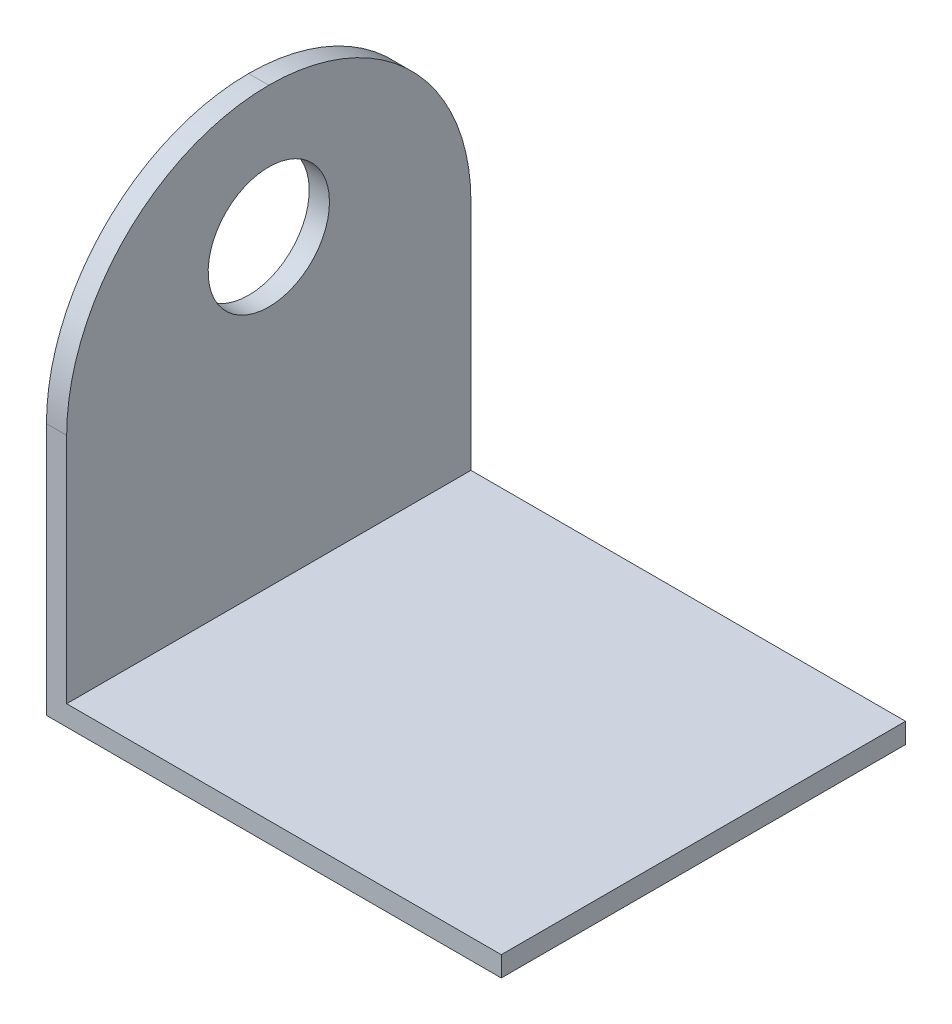
ISO-10303-21;
HEADER;
FILE_DESCRIPTION(('STEP AP214'),'2;1');
FILE_NAME('part.step','',(''),(''),'','','');
FILE_SCHEMA(('AUTOMOTIVE_DESIGN { 1 0 10303 214 1 1 1 1 }'));
ENDSEC;
DATA;
#1=APPLICATION_CONTEXT('core data for automotive mechanical design processes');
#2=APPLICATION_PROTOCOL_DEFINITION('international standard','automotive_design',2000,#1);
#3=PRODUCT_CONTEXT('',#1,'mechanical');
#4=PRODUCT('Part','Part','',(#3));
#5=PRODUCT_RELATED_PRODUCT_CATEGORY('part','',(#4));
#6=PRODUCT_DEFINITION_FORMATION('','',#4);
#7=PRODUCT_DEFINITION_CONTEXT('part definition',#1,'design');
#8=PRODUCT_DEFINITION('design','',#6,#7);
#9=PRODUCT_DEFINITION_SHAPE('','',#8);
#10=(LENGTH_UNIT() NAMED_UNIT(*) SI_UNIT(.MILLI.,.METRE.));
#11=(NAMED_UNIT(*) PLANE_ANGLE_UNIT() SI_UNIT($,.RADIAN.));
#12=(NAMED_UNIT(*) SI_UNIT($,.STERADIAN.) SOLID_ANGLE_UNIT());
#13=UNCERTAINTY_MEASURE_WITH_UNIT(LENGTH_MEASURE(1.E-05),#10,'distance_accuracy_value','');
#14=(GEOMETRIC_REPRESENTATION_CONTEXT(3) GLOBAL_UNCERTAINTY_ASSIGNED_CONTEXT((#13)) GLOBAL_UNIT_ASSIGNED_CONTEXT((#10,
#11,#12)) REPRESENTATION_CONTEXT('',''));
#15=CARTESIAN_POINT('',(0.,0.,0.));
#16=DIRECTION('',(0.,0.,1.));
#17=DIRECTION('',(1.,0.,0.));
#18=AXIS2_PLACEMENT_3D('',#15,#16,#17);
#19=CARTESIAN_POINT('',(2.,0.,-40.));
#20=DIRECTION('',(1.,0.,0.));
#21=DIRECTION('',(0.,0.,-1.));
#22=AXIS2_PLACEMENT_3D('',#19,#20,#21);
#23=PLANE('',#22);
#24=CARTESIAN_POINT('',(2.,-13.0021745138552,-20.));
#25=DIRECTION('',(1.,0.,0.));
#26=DIRECTION('',(0.,0.,-1.));
#27=AXIS2_PLACEMENT_3D('',#24,#25,#26);
#28=CIRCLE('',#27,6.00000000000004);
#29=CARTESIAN_POINT('',(2.,-13.0021745138552,-26.));
#30=VERTEX_POINT('',#29);
#31=EDGE_CURVE('E135',#30,#30,#28,.T.);
#32=ORIENTED_EDGE('',*,*,#31,.F.);
#33=EDGE_LOOP('',(#32));
#34=FACE_BOUND('',#33,.T.);
#35=CARTESIAN_POINT('',(2.,-20.,-20.));
#36=DIRECTION('',(1.,0.,0.));
#37=DIRECTION('',(0.,0.,-1.));
#38=AXIS2_PLACEMENT_3D('',#35,#36,#37);
#39=CIRCLE('',#38,20.);
#40=CARTESIAN_POINT('',(2.,-20.,-40.));
#41=VERTEX_POINT('',#40);
#42=CARTESIAN_POINT('',(2.,0.,-20.));
#43=VERTEX_POINT('',#42);
#44=EDGE_CURVE('E154',#41,#43,#39,.T.);
#45=ORIENTED_EDGE('',*,*,#44,.T.);
#46=CARTESIAN_POINT('',(2.,-20.,-20.));
#47=DIRECTION('',(1.,0.,0.));
#48=DIRECTION('',(0.,0.,-1.));
#49=AXIS2_PLACEMENT_3D('',#46,#47,#48);
#50=CIRCLE('',#49,20.);
#51=CARTESIAN_POINT('',(2.,-20.,0.));
#52=VERTEX_POINT('',#51);
#53=EDGE_CURVE('E11',#43,#52,#50,.T.);
#54=ORIENTED_EDGE('',*,*,#53,.T.);
#55=DIRECTION('',(0.,1.,0.));
#56=VECTOR('',#55,1.);
#57=CARTESIAN_POINT('',(2.,0.,0.));
#58=LINE('',#57,#56);
#59=CARTESIAN_POINT('',(2.,-43.,0.));
#60=VERTEX_POINT('',#59);
#61=EDGE_CURVE('E109',#60,#52,#58,.T.);
#62=ORIENTED_EDGE('',*,*,#61,.F.);
#63=DIRECTION('',(0.,0.,1.));
#64=VECTOR('',#63,1.);
#65=CARTESIAN_POINT('',(2.,-43.,-40.));
#66=LINE('',#65,#64);
#67=CARTESIAN_POINT('',(2.,-43.,-40.));
#68=VERTEX_POINT('',#67);
#69=EDGE_CURVE('E144',#68,#60,#66,.T.);
#70=ORIENTED_EDGE('',*,*,#69,.F.);
#71=DIRECTION('',(0.,1.,0.));
#72=VECTOR('',#71,1.);
#73=CARTESIAN_POINT('',(2.,0.,-40.));
#74=LINE('',#73,#72);
#75=EDGE_CURVE('E117',#68,#41,#74,.T.);
#76=ORIENTED_EDGE('',*,*,#75,.T.);
#77=EDGE_LOOP('',(#45,#54,#62,#70,#76));
#78=FACE_BOUND('',#77,.T.);
#79=ADVANCED_FACE('F39',(#34,#78),#23,.T.);
#80=CARTESIAN_POINT('',(2.,-43.,-40.));
#81=DIRECTION('',(0.,1.,0.));
#82=DIRECTION('',(0.,0.,1.));
#83=AXIS2_PLACEMENT_3D('',#80,#81,#82);
#84=PLANE('',#83);
#85=DIRECTION('',(-1.,0.,0.));
#86=VECTOR('',#85,1.);
#87=CARTESIAN_POINT('',(2.,-43.,0.));
#88=LINE('',#87,#86);
#89=CARTESIAN_POINT('',(45.,-43.,0.));
#90=VERTEX_POINT('',#89);
#91=EDGE_CURVE('E140',#90,#60,#88,.T.);
#92=ORIENTED_EDGE('',*,*,#91,.F.);
#93=DIRECTION('',(0.,0.,1.));
#94=VECTOR('',#93,1.);
#95=CARTESIAN_POINT('',(45.,-43.,-40.));
#96=LINE('',#95,#94);
#97=CARTESIAN_POINT('',(45.,-43.,-40.));
#98=VERTEX_POINT('',#97);
#99=EDGE_CURVE('E147',#98,#90,#96,.T.);
#100=ORIENTED_EDGE('',*,*,#99,.F.);
#101=DIRECTION('',(-1.,0.,0.));
#102=VECTOR('',#101,1.);
#103=CARTESIAN_POINT('',(2.,-43.,-40.));
#104=LINE('',#103,#102);
#105=EDGE_CURVE('E125',#98,#68,#104,.T.);
#106=ORIENTED_EDGE('',*,*,#105,.T.);
#107=ORIENTED_EDGE('',*,*,#69,.T.);
#108=EDGE_LOOP('',(#92,#100,#106,#107));
#109=FACE_BOUND('',#108,.T.);
#110=ADVANCED_FACE('F166',(#109),#84,.T.);
#111=CARTESIAN_POINT('',(45.,-43.,-40.));
#112=DIRECTION('',(1.,0.,0.));
#113=DIRECTION('',(0.,0.,-1.));
#114=AXIS2_PLACEMENT_3D('',#111,#112,#113);
#115=PLANE('',#114);
#116=DIRECTION('',(0.,1.,0.));
#117=VECTOR('',#116,1.);
#118=CARTESIAN_POINT('',(45.,-43.,0.));
#119=LINE('',#118,#117);
#120=CARTESIAN_POINT('',(45.,-45.,0.));
#121=VERTEX_POINT('',#120);
#122=EDGE_CURVE('E137',#121,#90,#119,.T.);
#123=ORIENTED_EDGE('',*,*,#122,.F.);
#124=DIRECTION('',(0.,0.,1.));
#125=VECTOR('',#124,1.);
#126=CARTESIAN_POINT('',(45.,-45.,-40.));
#127=LINE('',#126,#125);
#128=CARTESIAN_POINT('',(45.,-45.,-40.));
#129=VERTEX_POINT('',#128);
#130=EDGE_CURVE('E116',#129,#121,#127,.T.);
#131=ORIENTED_EDGE('',*,*,#130,.F.);
#132=DIRECTION('',(0.,1.,0.));
#133=VECTOR('',#132,1.);
#134=CARTESIAN_POINT('',(45.,-43.,-40.));
#135=LINE('',#134,#133);
#136=EDGE_CURVE('E123',#129,#98,#135,.T.);
#137=ORIENTED_EDGE('',*,*,#136,.T.);
#138=ORIENTED_EDGE('',*,*,#99,.T.);
#139=EDGE_LOOP('',(#123,#131,#137,#138));
#140=FACE_BOUND('',#139,.T.);
#141=ADVANCED_FACE('F169',(#140),#115,.T.);
#142=CARTESIAN_POINT('',(0.,-45.,-40.));
#143=DIRECTION('',(0.,-1.,0.));
#144=DIRECTION('',(0.,0.,-1.));
#145=AXIS2_PLACEMENT_3D('',#142,#143,#144);
#146=PLANE('',#145);
#147=DIRECTION('',(1.,0.,0.));
#148=VECTOR('',#147,1.);
#149=CARTESIAN_POINT('',(0.,-45.,0.));
#150=LINE('',#149,#148);
#151=CARTESIAN_POINT('',(0.,-45.,0.));
#152=VERTEX_POINT('',#151);
#153=EDGE_CURVE('E115',#152,#121,#150,.T.);
#154=ORIENTED_EDGE('',*,*,#153,.F.);
#155=DIRECTION('',(0.,0.,1.));
#156=VECTOR('',#155,1.);
#157=CARTESIAN_POINT('',(0.,-45.,-40.));
#158=LINE('',#157,#156);
#159=CARTESIAN_POINT('',(0.,-45.,-40.));
#160=VERTEX_POINT('',#159);
#161=EDGE_CURVE('E101',#160,#152,#158,.T.);
#162=ORIENTED_EDGE('',*,*,#161,.F.);
#163=DIRECTION('',(1.,0.,0.));
#164=VECTOR('',#163,1.);
#165=CARTESIAN_POINT('',(0.,-45.,-40.));
#166=LINE('',#165,#164);
#167=EDGE_CURVE('E108',#160,#129,#166,.T.);
#168=ORIENTED_EDGE('',*,*,#167,.T.);
#169=ORIENTED_EDGE('',*,*,#130,.T.);
#170=EDGE_LOOP('',(#154,#162,#168,#169));
#171=FACE_BOUND('',#170,.T.);
#172=ADVANCED_FACE('F113',(#171),#146,.T.);
#173=CARTESIAN_POINT('',(0.,0.,-40.));
#174=DIRECTION('',(-1.,0.,0.));
#175=DIRECTION('',(0.,-1.,0.));
#176=AXIS2_PLACEMENT_3D('',#173,#174,#175);
#177=PLANE('',#176);
#178=CARTESIAN_POINT('',(0.,-13.0021745138552,-20.));
#179=DIRECTION('',(-1.,0.,0.));
#180=DIRECTION('',(0.,-1.,0.));
#181=AXIS2_PLACEMENT_3D('',#178,#179,#180);
#182=CIRCLE('',#181,6.00000000000004);
#183=CARTESIAN_POINT('',(0.,-19.0021745138552,-20.));
#184=VERTEX_POINT('',#183);
#185=EDGE_CURVE('E201',#184,#184,#182,.T.);
#186=ORIENTED_EDGE('',*,*,#185,.F.);
#187=EDGE_LOOP('',(#186));
#188=FACE_BOUND('',#187,.T.);
#189=DIRECTION('',(0.,-1.,0.));
#190=VECTOR('',#189,1.);
#191=CARTESIAN_POINT('',(0.,0.,0.));
#192=LINE('',#191,#190);
#193=CARTESIAN_POINT('',(0.,-20.,0.));
#194=VERTEX_POINT('',#193);
#195=EDGE_CURVE('E133',#194,#152,#192,.T.);
#196=ORIENTED_EDGE('',*,*,#195,.F.);
#197=CARTESIAN_POINT('',(0.,-20.,-20.));
#198=DIRECTION('',(-1.,0.,0.));
#199=DIRECTION('',(0.,-1.,0.));
#200=AXIS2_PLACEMENT_3D('',#197,#198,#199);
#201=CIRCLE('',#200,20.);
#202=CARTESIAN_POINT('',(0.,0.,-20.));
#203=VERTEX_POINT('',#202);
#204=EDGE_CURVE('E47',#194,#203,#201,.T.);
#205=ORIENTED_EDGE('',*,*,#204,.T.);
#206=CARTESIAN_POINT('',(0.,-20.,-20.));
#207=DIRECTION('',(-1.,0.,0.));
#208=DIRECTION('',(0.,-1.,0.));
#209=AXIS2_PLACEMENT_3D('',#206,#207,#208);
#210=CIRCLE('',#209,20.);
#211=CARTESIAN_POINT('',(0.,-20.,-40.));
#212=VERTEX_POINT('',#211);
#213=EDGE_CURVE('E104',#203,#212,#210,.T.);
#214=ORIENTED_EDGE('',*,*,#213,.T.);
#215=DIRECTION('',(0.,-1.,0.));
#216=VECTOR('',#215,1.);
#217=CARTESIAN_POINT('',(0.,0.,-40.));
#218=LINE('',#217,#216);
#219=EDGE_CURVE('E97',#212,#160,#218,.T.);
#220=ORIENTED_EDGE('',*,*,#219,.T.);
#221=ORIENTED_EDGE('',*,*,#161,.T.);
#222=EDGE_LOOP('',(#196,#205,#214,#220,#221));
#223=FACE_BOUND('',#222,.T.);
#224=ADVANCED_FACE('F100',(#188,#223),#177,.T.);
#225=CARTESIAN_POINT('',(0.,0.,-40.));
#226=DIRECTION('',(0.,0.,-1.));
#227=DIRECTION('',(-1.,0.,0.));
#228=AXIS2_PLACEMENT_3D('',#225,#226,#227);
#229=PLANE('',#228);
#230=ORIENTED_EDGE('',*,*,#219,.F.);
#231=DIRECTION('',(-1.,0.,0.));
#232=VECTOR('',#231,1.);
#233=CARTESIAN_POINT('',(0.,-20.,-40.));
#234=LINE('',#233,#232);
#235=EDGE_CURVE('E152',#212,#41,#234,.F.);
#236=ORIENTED_EDGE('',*,*,#235,.T.);
#237=ORIENTED_EDGE('',*,*,#75,.F.);
#238=ORIENTED_EDGE('',*,*,#105,.F.);
#239=ORIENTED_EDGE('',*,*,#136,.F.);
#240=ORIENTED_EDGE('',*,*,#167,.F.);
#241=EDGE_LOOP('',(#230,#236,#237,#238,#239,#240));
#242=FACE_BOUND('',#241,.T.);
#243=ADVANCED_FACE('F120',(#242),#229,.T.);
#244=CARTESIAN_POINT('',(0.,0.,0.));
#245=DIRECTION('',(0.,0.,-1.));
#246=DIRECTION('',(-1.,0.,0.));
#247=AXIS2_PLACEMENT_3D('',#244,#245,#246);
#248=PLANE('',#247);
#249=ORIENTED_EDGE('',*,*,#61,.T.);
#250=DIRECTION('',(-1.,0.,0.));
#251=VECTOR('',#250,1.);
#252=CARTESIAN_POINT('',(0.,-20.,0.));
#253=LINE('',#252,#251);
#254=EDGE_CURVE('E156',#52,#194,#253,.T.);
#255=ORIENTED_EDGE('',*,*,#254,.T.);
#256=ORIENTED_EDGE('',*,*,#195,.T.);
#257=ORIENTED_EDGE('',*,*,#153,.T.);
#258=ORIENTED_EDGE('',*,*,#122,.T.);
#259=ORIENTED_EDGE('',*,*,#91,.T.);
#260=EDGE_LOOP('',(#249,#255,#256,#257,#258,#259));
#261=FACE_BOUND('',#260,.T.);
#262=ADVANCED_FACE('F162',(#261),#248,.F.);
#263=CARTESIAN_POINT('',(0.,-20.,-20.));
#264=DIRECTION('',(-1.,0.,0.));
#265=DIRECTION('',(0.,0.,1.));
#266=AXIS2_PLACEMENT_3D('',#263,#264,#265);
#267=CYLINDRICAL_SURFACE('',#266,20.);
#268=ORIENTED_EDGE('',*,*,#44,.F.);
#269=ORIENTED_EDGE('',*,*,#235,.F.);
#270=ORIENTED_EDGE('',*,*,#213,.F.);
#271=DIRECTION('',(-1.,0.,0.));
#272=VECTOR('',#271,1.);
#273=CARTESIAN_POINT('',(0.,0.,-20.));
#274=LINE('',#273,#272);
#275=EDGE_CURVE('E146',#43,#203,#274,.T.);
#276=ORIENTED_EDGE('',*,*,#275,.F.);
#277=EDGE_LOOP('',(#268,#269,#270,#276));
#278=FACE_BOUND('',#277,.T.);
#279=ADVANCED_FACE('F160',(#278),#267,.T.);
#280=CARTESIAN_POINT('',(0.,-20.,-20.));
#281=DIRECTION('',(1.,0.,0.));
#282=DIRECTION('',(0.,0.,-1.));
#283=AXIS2_PLACEMENT_3D('',#280,#281,#282);
#284=CYLINDRICAL_SURFACE('',#283,20.);
#285=ORIENTED_EDGE('',*,*,#53,.F.);
#286=ORIENTED_EDGE('',*,*,#275,.T.);
#287=ORIENTED_EDGE('',*,*,#204,.F.);
#288=ORIENTED_EDGE('',*,*,#254,.F.);
#289=EDGE_LOOP('',(#285,#286,#287,#288));
#290=FACE_BOUND('',#289,.T.);
#291=ADVANCED_FACE('F41',(#290),#284,.T.);
#292=CARTESIAN_POINT('',(10.,-13.0021745138552,-20.));
#293=DIRECTION('',(-1.,0.,0.));
#294=DIRECTION('',(0.,-1.,0.));
#295=AXIS2_PLACEMENT_3D('',#292,#293,#294);
#296=CYLINDRICAL_SURFACE('',#295,6.00000000000004);
#297=ORIENTED_EDGE('',*,*,#31,.T.);
#298=EDGE_LOOP('',(#297));
#299=FACE_BOUND('',#298,.T.);
#300=ORIENTED_EDGE('',*,*,#185,.T.);
#301=EDGE_LOOP('',(#300));
#302=FACE_BOUND('',#301,.T.);
#303=ADVANCED_FACE('F191',(#299,#302),#296,.F.);
#304=CLOSED_SHELL('',(#79,#110,#141,#172,#224,#243,#262,#279,#291,#303));
#305=MANIFOLD_SOLID_BREP('B2',#304);
#306=ADVANCED_BREP_SHAPE_REPRESENTATION('',(#18,#305),#14);
#307=SHAPE_DEFINITION_REPRESENTATION(#9,#306);
ENDSEC;
END-ISO-10303-21;
